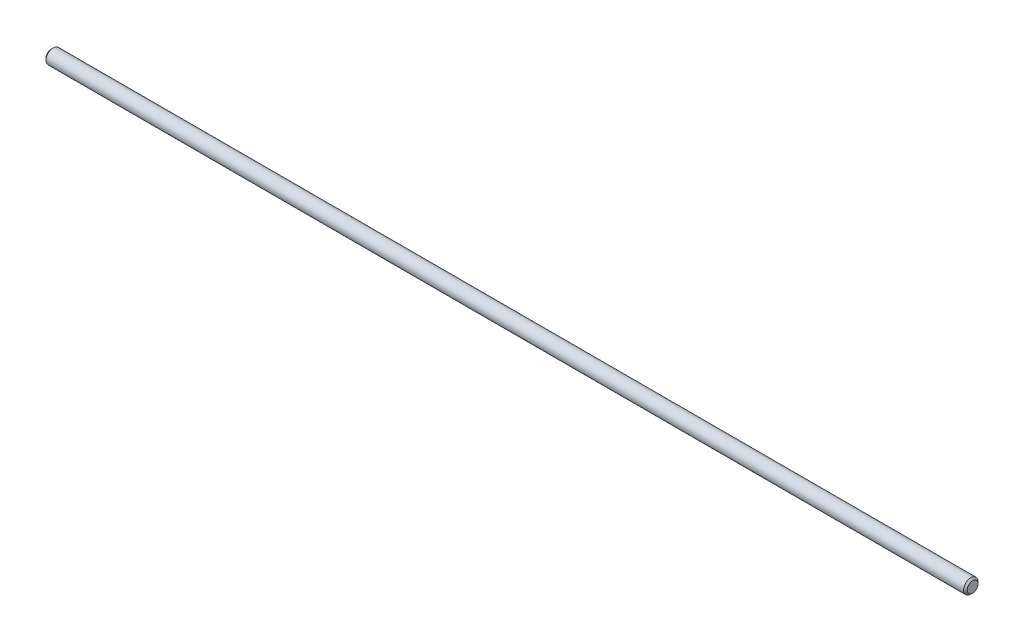
ISO-10303-21;
HEADER;
FILE_DESCRIPTION(('STEP AP214'),'2;1');
FILE_NAME('part.step','',(''),(''),'','','');
FILE_SCHEMA(('AUTOMOTIVE_DESIGN { 1 0 10303 214 1 1 1 1 }'));
ENDSEC;
DATA;
#1=APPLICATION_CONTEXT('core data for automotive mechanical design processes');
#2=APPLICATION_PROTOCOL_DEFINITION('international standard','automotive_design',2000,#1);
#3=PRODUCT_CONTEXT('',#1,'mechanical');
#4=PRODUCT('Part','Part','',(#3));
#5=PRODUCT_RELATED_PRODUCT_CATEGORY('part','',(#4));
#6=PRODUCT_DEFINITION_FORMATION('','',#4);
#7=PRODUCT_DEFINITION_CONTEXT('part definition',#1,'design');
#8=PRODUCT_DEFINITION('design','',#6,#7);
#9=PRODUCT_DEFINITION_SHAPE('','',#8);
#10=(LENGTH_UNIT() NAMED_UNIT(*) SI_UNIT(.MILLI.,.METRE.));
#11=(NAMED_UNIT(*) PLANE_ANGLE_UNIT() SI_UNIT($,.RADIAN.));
#12=(NAMED_UNIT(*) SI_UNIT($,.STERADIAN.) SOLID_ANGLE_UNIT());
#13=UNCERTAINTY_MEASURE_WITH_UNIT(LENGTH_MEASURE(1.E-05),#10,'distance_accuracy_value','');
#14=(GEOMETRIC_REPRESENTATION_CONTEXT(3) GLOBAL_UNCERTAINTY_ASSIGNED_CONTEXT((#13)) GLOBAL_UNIT_ASSIGNED_CONTEXT((#10,
#11,#12)) REPRESENTATION_CONTEXT('',''));
#15=CARTESIAN_POINT('',(0.,0.,0.));
#16=DIRECTION('',(0.,0.,1.));
#17=DIRECTION('',(1.,0.,0.));
#18=AXIS2_PLACEMENT_3D('',#15,#16,#17);
#19=CARTESIAN_POINT('',(-609.6,0.,0.));
#20=DIRECTION('',(1.,0.,0.));
#21=DIRECTION('',(0.,0.,-1.));
#22=AXIS2_PLACEMENT_3D('',#19,#20,#21);
#23=CYLINDRICAL_SURFACE('',#22,4.7625);
#24=CARTESIAN_POINT('',(-608.409375,0.,0.));
#25=DIRECTION('',(1.,0.,0.));
#26=DIRECTION('',(0.,0.,-1.));
#27=AXIS2_PLACEMENT_3D('',#24,#25,#26);
#28=CIRCLE('',#27,4.7625);
#29=CARTESIAN_POINT('',(-608.409375,0.,-4.7625));
#30=VERTEX_POINT('',#29);
#31=EDGE_CURVE('E43',#30,#30,#28,.T.);
#32=CARTESIAN_POINT('',(-1.19062499999978,0.,0.));
#33=DIRECTION('',(1.,0.,0.));
#34=DIRECTION('',(0.,0.,-1.));
#35=AXIS2_PLACEMENT_3D('',#32,#33,#34);
#36=CIRCLE('',#35,4.7625);
#37=CARTESIAN_POINT('',(-1.19062499999978,0.,-4.7625));
#38=VERTEX_POINT('',#37);
#39=EDGE_CURVE('E47',#38,#38,#36,.F.);
#40=CARTESIAN_POINT('',(-608.409375,0.,-4.7625));
#41=CARTESIAN_POINT('',(-602.0841796875,0.,-4.7625));
#42=CARTESIAN_POINT('',(-595.758984375,0.,-4.7625));
#43=CARTESIAN_POINT('',(-583.10859375,0.,-4.7625));
#44=CARTESIAN_POINT('',(-576.7833984375,0.,-4.7625));
#45=CARTESIAN_POINT('',(-564.1330078125,0.,-4.7625));
#46=CARTESIAN_POINT('',(-557.8078125,0.,-4.7625));
#47=CARTESIAN_POINT('',(-545.157421875,0.,-4.7625));
#48=CARTESIAN_POINT('',(-538.8322265625,0.,-4.7625));
#49=CARTESIAN_POINT('',(-526.1818359375,0.,-4.7625));
#50=CARTESIAN_POINT('',(-519.856640625,0.,-4.7625));
#51=CARTESIAN_POINT('',(-507.20625,0.,-4.7625));
#52=CARTESIAN_POINT('',(-500.8810546875,0.,-4.7625));
#53=CARTESIAN_POINT('',(-488.2306640625,0.,-4.7625));
#54=CARTESIAN_POINT('',(-481.90546875,0.,-4.7625));
#55=CARTESIAN_POINT('',(-469.255078125,0.,-4.7625));
#56=CARTESIAN_POINT('',(-462.9298828125,0.,-4.7625));
#57=CARTESIAN_POINT('',(-450.2794921875,0.,-4.7625));
#58=CARTESIAN_POINT('',(-443.954296875,0.,-4.7625));
#59=CARTESIAN_POINT('',(-431.30390625,0.,-4.7625));
#60=CARTESIAN_POINT('',(-424.9787109375,0.,-4.7625));
#61=CARTESIAN_POINT('',(-412.3283203125,0.,-4.7625));
#62=CARTESIAN_POINT('',(-406.003125,0.,-4.7625));
#63=CARTESIAN_POINT('',(-393.352734375,0.,-4.7625));
#64=CARTESIAN_POINT('',(-387.0275390625,0.,-4.7625));
#65=CARTESIAN_POINT('',(-374.3771484375,0.,-4.7625));
#66=CARTESIAN_POINT('',(-368.051953125,0.,-4.7625));
#67=CARTESIAN_POINT('',(-355.4015625,0.,-4.7625));
#68=CARTESIAN_POINT('',(-349.0763671875,0.,-4.7625));
#69=CARTESIAN_POINT('',(-336.4259765625,0.,-4.7625));
#70=CARTESIAN_POINT('',(-330.10078125,0.,-4.7625));
#71=CARTESIAN_POINT('',(-317.450390625,0.,-4.7625));
#72=CARTESIAN_POINT('',(-311.1251953125,0.,-4.7625));
#73=CARTESIAN_POINT('',(-298.4748046875,0.,-4.7625));
#74=CARTESIAN_POINT('',(-292.149609375,0.,-4.7625));
#75=CARTESIAN_POINT('',(-279.49921875,0.,-4.7625));
#76=CARTESIAN_POINT('',(-273.1740234375,0.,-4.7625));
#77=CARTESIAN_POINT('',(-260.5236328125,0.,-4.7625));
#78=CARTESIAN_POINT('',(-254.1984375,0.,-4.7625));
#79=CARTESIAN_POINT('',(-241.548046875,0.,-4.7625));
#80=CARTESIAN_POINT('',(-235.2228515625,0.,-4.7625));
#81=CARTESIAN_POINT('',(-222.5724609375,0.,-4.7625));
#82=CARTESIAN_POINT('',(-216.247265625,0.,-4.7625));
#83=CARTESIAN_POINT('',(-203.596875,0.,-4.7625));
#84=CARTESIAN_POINT('',(-197.2716796875,0.,-4.7625));
#85=CARTESIAN_POINT('',(-184.6212890625,0.,-4.7625));
#86=CARTESIAN_POINT('',(-178.29609375,0.,-4.7625));
#87=CARTESIAN_POINT('',(-165.645703125,0.,-4.7625));
#88=CARTESIAN_POINT('',(-159.3205078125,0.,-4.7625));
#89=CARTESIAN_POINT('',(-146.6701171875,0.,-4.7625));
#90=CARTESIAN_POINT('',(-140.344921875,0.,-4.7625));
#91=CARTESIAN_POINT('',(-127.69453125,0.,-4.7625));
#92=CARTESIAN_POINT('',(-121.3693359375,0.,-4.7625));
#93=CARTESIAN_POINT('',(-108.7189453125,0.,-4.7625));
#94=CARTESIAN_POINT('',(-102.39375,0.,-4.7625));
#95=CARTESIAN_POINT('',(-89.7433593749998,0.,-4.7625));
#96=CARTESIAN_POINT('',(-83.4181640624998,0.,-4.7625));
#97=CARTESIAN_POINT('',(-70.7677734374998,0.,-4.7625));
#98=CARTESIAN_POINT('',(-64.4425781249998,0.,-4.7625));
#99=CARTESIAN_POINT('',(-51.7921874999998,0.,-4.7625));
#100=CARTESIAN_POINT('',(-45.4669921874998,0.,-4.7625));
#101=CARTESIAN_POINT('',(-32.8166015624998,0.,-4.7625));
#102=CARTESIAN_POINT('',(-26.4914062499998,0.,-4.7625));
#103=CARTESIAN_POINT('',(-13.8410156249998,0.,-4.7625));
#104=CARTESIAN_POINT('',(-7.51582031249979,0.,-4.7625));
#105=CARTESIAN_POINT('',(-1.19062499999978,0.,-4.7625));
#106=B_SPLINE_CURVE_WITH_KNOTS('',3,(#40,#41,#42,#43,#44,#45,#46,#47,#48,#49,#50,#51,#52,#53,
#54,#55,#56,#57,#58,#59,#60,#61,#62,#63,#64,#65,#66,#67,#68,#69,#70,#71,#72,#73,#74,#75,#76,#77,
#78,#79,#80,#81,#82,#83,#84,#85,#86,#87,#88,#89,#90,#91,#92,#93,#94,#95,#96,#97,#98,#99,#100,
#101,#102,#103,#104,#105),.UNSPECIFIED.,.F.,.F.,(4,2,2,2,2,2,2,2,2,2,2,2,2,2,2,2,2,2,2,2,2,2,2,
2,2,2,2,2,2,2,2,2,4),(0.,18.9755859374999,37.951171875,56.9267578125,75.9023437499999,
94.8779296875,113.853515625,132.8291015625,151.8046875,170.7802734375,189.755859375,
208.7314453125,227.70703125,246.6826171875,265.658203125,284.6337890625,303.609375,
322.5849609375,341.560546875,360.5361328125,379.51171875,398.4873046875,417.462890625,
436.4384765625,455.4140625,474.3896484375,493.365234375,512.3408203125,531.31640625,
550.2919921875,569.267578125,588.2431640625,607.21875),.UNSPECIFIED.);
#107=EDGE_CURVE('BSEAM32',#30,#38,#106,.T.);
#108=ORIENTED_EDGE('',*,*,#31,.T.);
#109=ORIENTED_EDGE('',*,*,#39,.T.);
#110=ORIENTED_EDGE('',*,*,#107,.T.);
#111=ORIENTED_EDGE('',*,*,#107,.F.);
#112=EDGE_LOOP('',(#108,#110,#109,#111));
#113=FACE_BOUND('',#112,.T.);
#114=ADVANCED_FACE('F32',(#113),#23,.T.);
#115=CARTESIAN_POINT('',(-609.6,0.,0.));
#116=DIRECTION('',(1.,0.,0.));
#117=DIRECTION('',(0.,0.,-1.));
#118=AXIS2_PLACEMENT_3D('',#115,#116,#117);
#119=PLANE('',#118);
#120=CARTESIAN_POINT('',(-609.6,0.,0.));
#121=DIRECTION('',(1.,0.,0.));
#122=DIRECTION('',(0.,0.,-1.));
#123=AXIS2_PLACEMENT_3D('',#120,#121,#122);
#124=CIRCLE('',#123,3.57187499999978);
#125=CARTESIAN_POINT('',(-609.6,0.,-3.57187499999978));
#126=VERTEX_POINT('',#125);
#127=EDGE_CURVE('E39',#126,#126,#124,.F.);
#128=ORIENTED_EDGE('',*,*,#127,.T.);
#129=EDGE_LOOP('',(#128));
#130=FACE_BOUND('',#129,.T.);
#131=ADVANCED_FACE('F63',(#130),#119,.F.);
#132=CARTESIAN_POINT('',(0.,0.,0.));
#133=DIRECTION('',(1.,0.,0.));
#134=DIRECTION('',(0.,0.,-1.));
#135=AXIS2_PLACEMENT_3D('',#132,#133,#134);
#136=PLANE('',#135);
#137=CARTESIAN_POINT('',(0.,0.,0.));
#138=DIRECTION('',(1.,0.,0.));
#139=DIRECTION('',(0.,0.,-1.));
#140=AXIS2_PLACEMENT_3D('',#137,#138,#139);
#141=CIRCLE('',#140,3.571875);
#142=CARTESIAN_POINT('',(0.,0.,-3.571875));
#143=VERTEX_POINT('',#142);
#144=EDGE_CURVE('E10',#143,#143,#141,.T.);
#145=ORIENTED_EDGE('',*,*,#144,.T.);
#146=EDGE_LOOP('',(#145));
#147=FACE_BOUND('',#146,.T.);
#148=ADVANCED_FACE('F60',(#147),#136,.T.);
#149=CARTESIAN_POINT('',(-608.409375,0.,0.));
#150=DIRECTION('',(1.,0.,0.));
#151=DIRECTION('',(0.,0.,-1.));
#152=AXIS2_PLACEMENT_3D('',#149,#150,#151);
#153=CONICAL_SURFACE('',#152,4.7625,0.785398163397448);
#154=ORIENTED_EDGE('',*,*,#127,.F.);
#155=EDGE_LOOP('',(#154));
#156=FACE_BOUND('',#155,.T.);
#157=ORIENTED_EDGE('',*,*,#31,.F.);
#158=EDGE_LOOP('',(#157));
#159=FACE_BOUND('',#158,.T.);
#160=ADVANCED_FACE('F56',(#156,#159),#153,.T.);
#161=CARTESIAN_POINT('',(0.,0.,0.));
#162=DIRECTION('',(-1.,0.,0.));
#163=DIRECTION('',(0.,0.,1.));
#164=AXIS2_PLACEMENT_3D('',#161,#162,#163);
#165=CONICAL_SURFACE('',#164,3.571875,0.785398163397541);
#166=ORIENTED_EDGE('',*,*,#39,.F.);
#167=EDGE_LOOP('',(#166));
#168=FACE_BOUND('',#167,.T.);
#169=ORIENTED_EDGE('',*,*,#144,.F.);
#170=EDGE_LOOP('',(#169));
#171=FACE_BOUND('',#170,.T.);
#172=ADVANCED_FACE('F34',(#168,#171),#165,.T.);
#173=CLOSED_SHELL('',(#114,#131,#148,#160,#172));
#174=MANIFOLD_SOLID_BREP('B2',#173);
#175=ADVANCED_BREP_SHAPE_REPRESENTATION('',(#18,#174),#14);
#176=SHAPE_DEFINITION_REPRESENTATION(#9,#175);
ENDSEC;
END-ISO-10303-21;
